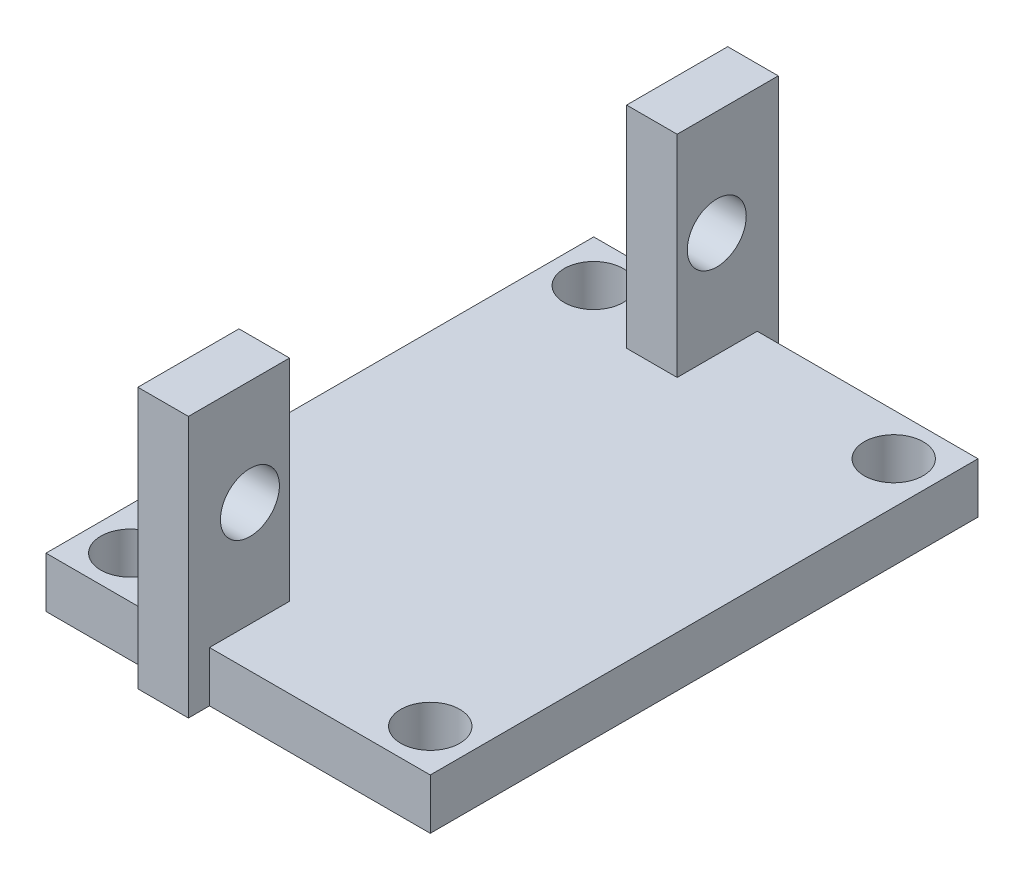
ISO-10303-21;
HEADER;
FILE_DESCRIPTION(('STEP AP214'),'2;1');
FILE_NAME('part.step','',(''),(''),'','','');
FILE_SCHEMA(('AUTOMOTIVE_DESIGN { 1 0 10303 214 1 1 1 1 }'));
ENDSEC;
DATA;
#1=APPLICATION_CONTEXT('core data for automotive mechanical design processes');
#2=APPLICATION_PROTOCOL_DEFINITION('international standard','automotive_design',2000,#1);
#3=PRODUCT_CONTEXT('',#1,'mechanical');
#4=PRODUCT('Part','Part','',(#3));
#5=PRODUCT_RELATED_PRODUCT_CATEGORY('part','',(#4));
#6=PRODUCT_DEFINITION_FORMATION('','',#4);
#7=PRODUCT_DEFINITION_CONTEXT('part definition',#1,'design');
#8=PRODUCT_DEFINITION('design','',#6,#7);
#9=PRODUCT_DEFINITION_SHAPE('','',#8);
#10=(LENGTH_UNIT() NAMED_UNIT(*) SI_UNIT(.MILLI.,.METRE.));
#11=(NAMED_UNIT(*) PLANE_ANGLE_UNIT() SI_UNIT($,.RADIAN.));
#12=(NAMED_UNIT(*) SI_UNIT($,.STERADIAN.) SOLID_ANGLE_UNIT());
#13=UNCERTAINTY_MEASURE_WITH_UNIT(LENGTH_MEASURE(1.E-05),#10,'distance_accuracy_value','');
#14=(GEOMETRIC_REPRESENTATION_CONTEXT(3) GLOBAL_UNCERTAINTY_ASSIGNED_CONTEXT((#13)) GLOBAL_UNIT_ASSIGNED_CONTEXT((#10,
#11,#12)) REPRESENTATION_CONTEXT('',''));
#15=CARTESIAN_POINT('',(0.,0.,0.));
#16=DIRECTION('',(0.,0.,1.));
#17=DIRECTION('',(1.,0.,0.));
#18=AXIS2_PLACEMENT_3D('',#15,#16,#17);
#19=CARTESIAN_POINT('',(0.,3.,0.));
#20=DIRECTION('',(0.,1.,0.));
#21=DIRECTION('',(0.,0.,1.));
#22=AXIS2_PLACEMENT_3D('',#19,#20,#21);
#23=PLANE('',#22);
#24=CARTESIAN_POINT('',(8.90000000000001,3.,-13.75));
#25=DIRECTION('',(0.,1.,0.));
#26=DIRECTION('',(0.,0.,1.));
#27=AXIS2_PLACEMENT_3D('',#24,#25,#26);
#28=CIRCLE('',#27,1.75);
#29=CARTESIAN_POINT('',(8.90000000000001,3.,-12.));
#30=VERTEX_POINT('',#29);
#31=EDGE_CURVE('E232',#30,#30,#28,.T.);
#32=ORIENTED_EDGE('',*,*,#31,.F.);
#33=EDGE_LOOP('',(#32));
#34=FACE_BOUND('',#33,.T.);
#35=CARTESIAN_POINT('',(-8.9,3.,13.75));
#36=DIRECTION('',(0.,1.,0.));
#37=DIRECTION('',(0.,0.,1.));
#38=AXIS2_PLACEMENT_3D('',#35,#36,#37);
#39=CIRCLE('',#38,1.75);
#40=CARTESIAN_POINT('',(-8.9,3.,15.5));
#41=VERTEX_POINT('',#40);
#42=EDGE_CURVE('E231',#41,#41,#39,.T.);
#43=ORIENTED_EDGE('',*,*,#42,.F.);
#44=EDGE_LOOP('',(#43));
#45=FACE_BOUND('',#44,.T.);
#46=CARTESIAN_POINT('',(8.90000000000001,3.,13.75));
#47=DIRECTION('',(0.,1.,0.));
#48=DIRECTION('',(0.,0.,1.));
#49=AXIS2_PLACEMENT_3D('',#46,#47,#48);
#50=CIRCLE('',#49,1.75);
#51=CARTESIAN_POINT('',(8.90000000000001,3.,15.5));
#52=VERTEX_POINT('',#51);
#53=EDGE_CURVE('E228',#52,#52,#50,.T.);
#54=ORIENTED_EDGE('',*,*,#53,.F.);
#55=EDGE_LOOP('',(#54));
#56=FACE_BOUND('',#55,.T.);
#57=CARTESIAN_POINT('',(-8.9,3.,-13.75));
#58=DIRECTION('',(0.,1.,0.));
#59=DIRECTION('',(0.,0.,1.));
#60=AXIS2_PLACEMENT_3D('',#57,#58,#59);
#61=CIRCLE('',#60,1.75);
#62=CARTESIAN_POINT('',(-8.9,3.,-12.));
#63=VERTEX_POINT('',#62);
#64=EDGE_CURVE('E235',#63,#63,#61,.T.);
#65=ORIENTED_EDGE('',*,*,#64,.F.);
#66=EDGE_LOOP('',(#65));
#67=FACE_BOUND('',#66,.T.);
#68=DIRECTION('',(-1.,0.,0.));
#69=VECTOR('',#68,1.);
#70=CARTESIAN_POINT('',(-11.4,3.,-16.25));
#71=LINE('',#70,#69);
#72=CARTESIAN_POINT('',(11.4,3.,-16.25));
#73=VERTEX_POINT('',#72);
#74=CARTESIAN_POINT('',(-1.7,3.,-16.25));
#75=VERTEX_POINT('',#74);
#76=EDGE_CURVE('E246',#73,#75,#71,.T.);
#77=ORIENTED_EDGE('',*,*,#76,.T.);
#78=DIRECTION('',(0.,0.,1.));
#79=VECTOR('',#78,1.);
#80=CARTESIAN_POINT('',(-1.7,3.,0.));
#81=LINE('',#80,#79);
#82=CARTESIAN_POINT('',(-1.7,3.,-11.5));
#83=VERTEX_POINT('',#82);
#84=EDGE_CURVE('E57',#75,#83,#81,.T.);
#85=ORIENTED_EDGE('',*,*,#84,.T.);
#86=DIRECTION('',(-1.,0.,0.));
#87=VECTOR('',#86,1.);
#88=CARTESIAN_POINT('',(0.,3.,-11.5));
#89=LINE('',#88,#87);
#90=CARTESIAN_POINT('',(-4.7,3.,-11.5));
#91=VERTEX_POINT('',#90);
#92=EDGE_CURVE('E52',#83,#91,#89,.T.);
#93=ORIENTED_EDGE('',*,*,#92,.T.);
#94=DIRECTION('',(0.,0.,-1.));
#95=VECTOR('',#94,1.);
#96=CARTESIAN_POINT('',(-4.7,3.,0.));
#97=LINE('',#96,#95);
#98=CARTESIAN_POINT('',(-4.7,3.,-16.25));
#99=VERTEX_POINT('',#98);
#100=EDGE_CURVE('E184',#91,#99,#97,.T.);
#101=ORIENTED_EDGE('',*,*,#100,.T.);
#102=CARTESIAN_POINT('',(-11.4,3.,-16.25));
#103=VERTEX_POINT('',#102);
#104=EDGE_CURVE('E244',#99,#103,#71,.T.);
#105=ORIENTED_EDGE('',*,*,#104,.T.);
#106=DIRECTION('',(0.,0.,1.));
#107=VECTOR('',#106,1.);
#108=CARTESIAN_POINT('',(-11.4,3.,-16.25));
#109=LINE('',#108,#107);
#110=CARTESIAN_POINT('',(-11.4,3.,16.25));
#111=VERTEX_POINT('',#110);
#112=EDGE_CURVE('E248',#103,#111,#109,.T.);
#113=ORIENTED_EDGE('',*,*,#112,.T.);
#114=DIRECTION('',(1.,0.,0.));
#115=VECTOR('',#114,1.);
#116=CARTESIAN_POINT('',(-11.4,3.,16.25));
#117=LINE('',#116,#115);
#118=CARTESIAN_POINT('',(-4.7,3.,16.25));
#119=VERTEX_POINT('',#118);
#120=EDGE_CURVE('E251',#111,#119,#117,.T.);
#121=ORIENTED_EDGE('',*,*,#120,.T.);
#122=DIRECTION('',(0.,0.,-1.));
#123=VECTOR('',#122,1.);
#124=CARTESIAN_POINT('',(-4.7,3.,0.));
#125=LINE('',#124,#123);
#126=CARTESIAN_POINT('',(-4.7,3.,11.5));
#127=VERTEX_POINT('',#126);
#128=EDGE_CURVE('E223',#119,#127,#125,.T.);
#129=ORIENTED_EDGE('',*,*,#128,.T.);
#130=DIRECTION('',(1.,0.,0.));
#131=VECTOR('',#130,1.);
#132=CARTESIAN_POINT('',(0.,3.,11.5));
#133=LINE('',#132,#131);
#134=CARTESIAN_POINT('',(-1.7,3.,11.5));
#135=VERTEX_POINT('',#134);
#136=EDGE_CURVE('E215',#127,#135,#133,.T.);
#137=ORIENTED_EDGE('',*,*,#136,.T.);
#138=DIRECTION('',(0.,0.,1.));
#139=VECTOR('',#138,1.);
#140=CARTESIAN_POINT('',(-1.7,3.,0.));
#141=LINE('',#140,#139);
#142=CARTESIAN_POINT('',(-1.7,3.,16.25));
#143=VERTEX_POINT('',#142);
#144=EDGE_CURVE('E218',#135,#143,#141,.T.);
#145=ORIENTED_EDGE('',*,*,#144,.T.);
#146=CARTESIAN_POINT('',(11.4,3.,16.25));
#147=VERTEX_POINT('',#146);
#148=EDGE_CURVE('E250',#143,#147,#117,.T.);
#149=ORIENTED_EDGE('',*,*,#148,.T.);
#150=DIRECTION('',(0.,0.,-1.));
#151=VECTOR('',#150,1.);
#152=CARTESIAN_POINT('',(11.4,3.,-16.25));
#153=LINE('',#152,#151);
#154=EDGE_CURVE('E241',#147,#73,#153,.T.);
#155=ORIENTED_EDGE('',*,*,#154,.T.);
#156=EDGE_LOOP('',(#77,#85,#93,#101,#105,#113,#121,#129,#137,#145,#149,#155));
#157=FACE_BOUND('',#156,.T.);
#158=ADVANCED_FACE('F35',(#34,#45,#56,#67,#157),#23,.T.);
#159=CARTESIAN_POINT('',(-11.4,3.,-16.25));
#160=DIRECTION('',(0.,0.,1.));
#161=DIRECTION('',(1.,0.,0.));
#162=AXIS2_PLACEMENT_3D('',#159,#160,#161);
#163=PLANE('',#162);
#164=DIRECTION('',(0.,-1.,0.));
#165=VECTOR('',#164,1.);
#166=CARTESIAN_POINT('',(-1.7,3.,-16.25));
#167=LINE('',#166,#165);
#168=CARTESIAN_POINT('',(-1.7,0.,-16.25));
#169=VERTEX_POINT('',#168);
#170=EDGE_CURVE('E186',#75,#169,#167,.T.);
#171=ORIENTED_EDGE('',*,*,#170,.F.);
#172=ORIENTED_EDGE('',*,*,#76,.F.);
#173=DIRECTION('',(0.,-1.,0.));
#174=VECTOR('',#173,1.);
#175=CARTESIAN_POINT('',(11.4,3.,-16.25));
#176=LINE('',#175,#174);
#177=CARTESIAN_POINT('',(11.4,0.,-16.25));
#178=VERTEX_POINT('',#177);
#179=EDGE_CURVE('E11',#73,#178,#176,.T.);
#180=ORIENTED_EDGE('',*,*,#179,.T.);
#181=DIRECTION('',(-1.,0.,0.));
#182=VECTOR('',#181,1.);
#183=CARTESIAN_POINT('',(-11.4,0.,-16.25));
#184=LINE('',#183,#182);
#185=EDGE_CURVE('E260',#178,#169,#184,.T.);
#186=ORIENTED_EDGE('',*,*,#185,.T.);
#187=EDGE_LOOP('',(#171,#172,#180,#186));
#188=FACE_BOUND('',#187,.T.);
#189=ADVANCED_FACE('F305',(#188),#163,.F.);
#190=DIRECTION('',(0.,1.,0.));
#191=VECTOR('',#190,1.);
#192=CARTESIAN_POINT('',(-4.7,3.,-16.25));
#193=LINE('',#192,#191);
#194=CARTESIAN_POINT('',(-4.7,0.,-16.25));
#195=VERTEX_POINT('',#194);
#196=EDGE_CURVE('E176',#195,#99,#193,.T.);
#197=ORIENTED_EDGE('',*,*,#196,.F.);
#198=CARTESIAN_POINT('',(-11.4,0.,-16.25));
#199=VERTEX_POINT('',#198);
#200=EDGE_CURVE('E258',#195,#199,#184,.T.);
#201=ORIENTED_EDGE('',*,*,#200,.T.);
#202=DIRECTION('',(0.,-1.,0.));
#203=VECTOR('',#202,1.);
#204=CARTESIAN_POINT('',(-11.4,3.,-16.25));
#205=LINE('',#204,#203);
#206=EDGE_CURVE('E44',#103,#199,#205,.T.);
#207=ORIENTED_EDGE('',*,*,#206,.F.);
#208=ORIENTED_EDGE('',*,*,#104,.F.);
#209=EDGE_LOOP('',(#197,#201,#207,#208));
#210=FACE_BOUND('',#209,.T.);
#211=ADVANCED_FACE('F311',(#210),#163,.F.);
#212=CARTESIAN_POINT('',(-11.4,3.,16.25));
#213=DIRECTION('',(0.,0.,-1.));
#214=DIRECTION('',(-1.,0.,0.));
#215=AXIS2_PLACEMENT_3D('',#212,#213,#214);
#216=PLANE('',#215);
#217=DIRECTION('',(0.,-1.,0.));
#218=VECTOR('',#217,1.);
#219=CARTESIAN_POINT('',(-4.7,3.,16.25));
#220=LINE('',#219,#218);
#221=CARTESIAN_POINT('',(-4.7,0.,16.25));
#222=VERTEX_POINT('',#221);
#223=EDGE_CURVE('E226',#119,#222,#220,.T.);
#224=ORIENTED_EDGE('',*,*,#223,.F.);
#225=ORIENTED_EDGE('',*,*,#120,.F.);
#226=DIRECTION('',(0.,-1.,0.));
#227=VECTOR('',#226,1.);
#228=CARTESIAN_POINT('',(-11.4,3.,16.25));
#229=LINE('',#228,#227);
#230=CARTESIAN_POINT('',(-11.4,0.,16.25));
#231=VERTEX_POINT('',#230);
#232=EDGE_CURVE('E269',#111,#231,#229,.T.);
#233=ORIENTED_EDGE('',*,*,#232,.T.);
#234=DIRECTION('',(1.,0.,0.));
#235=VECTOR('',#234,1.);
#236=CARTESIAN_POINT('',(-11.4,0.,16.25));
#237=LINE('',#236,#235);
#238=EDGE_CURVE('E245',#231,#222,#237,.T.);
#239=ORIENTED_EDGE('',*,*,#238,.T.);
#240=EDGE_LOOP('',(#224,#225,#233,#239));
#241=FACE_BOUND('',#240,.T.);
#242=ADVANCED_FACE('F322',(#241),#216,.F.);
#243=DIRECTION('',(0.,1.,0.));
#244=VECTOR('',#243,1.);
#245=CARTESIAN_POINT('',(-1.7,3.,16.25));
#246=LINE('',#245,#244);
#247=CARTESIAN_POINT('',(-1.7,0.,16.25));
#248=VERTEX_POINT('',#247);
#249=EDGE_CURVE('E221',#248,#143,#246,.T.);
#250=ORIENTED_EDGE('',*,*,#249,.F.);
#251=CARTESIAN_POINT('',(11.4,0.,16.25));
#252=VERTEX_POINT('',#251);
#253=EDGE_CURVE('E264',#248,#252,#237,.T.);
#254=ORIENTED_EDGE('',*,*,#253,.T.);
#255=DIRECTION('',(0.,-1.,0.));
#256=VECTOR('',#255,1.);
#257=CARTESIAN_POINT('',(11.4,3.,16.25));
#258=LINE('',#257,#256);
#259=EDGE_CURVE('E254',#147,#252,#258,.T.);
#260=ORIENTED_EDGE('',*,*,#259,.F.);
#261=ORIENTED_EDGE('',*,*,#148,.F.);
#262=EDGE_LOOP('',(#250,#254,#260,#261));
#263=FACE_BOUND('',#262,.T.);
#264=ADVANCED_FACE('F325',(#263),#216,.F.);
#265=CARTESIAN_POINT('',(11.4,3.,-16.25));
#266=DIRECTION('',(-1.,0.,0.));
#267=DIRECTION('',(0.,0.,1.));
#268=AXIS2_PLACEMENT_3D('',#265,#266,#267);
#269=PLANE('',#268);
#270=DIRECTION('',(0.,0.,-1.));
#271=VECTOR('',#270,1.);
#272=CARTESIAN_POINT('',(11.4,0.,-16.25));
#273=LINE('',#272,#271);
#274=EDGE_CURVE('E255',#252,#178,#273,.T.);
#275=ORIENTED_EDGE('',*,*,#274,.T.);
#276=ORIENTED_EDGE('',*,*,#179,.F.);
#277=ORIENTED_EDGE('',*,*,#154,.F.);
#278=ORIENTED_EDGE('',*,*,#259,.T.);
#279=EDGE_LOOP('',(#275,#276,#277,#278));
#280=FACE_BOUND('',#279,.T.);
#281=ADVANCED_FACE('F37',(#280),#269,.F.);
#282=CARTESIAN_POINT('',(-11.4,3.,-16.25));
#283=DIRECTION('',(1.,0.,0.));
#284=DIRECTION('',(0.,0.,-1.));
#285=AXIS2_PLACEMENT_3D('',#282,#283,#284);
#286=PLANE('',#285);
#287=DIRECTION('',(0.,0.,1.));
#288=VECTOR('',#287,1.);
#289=CARTESIAN_POINT('',(-11.4,0.,-16.25));
#290=LINE('',#289,#288);
#291=EDGE_CURVE('E262',#199,#231,#290,.T.);
#292=ORIENTED_EDGE('',*,*,#291,.T.);
#293=ORIENTED_EDGE('',*,*,#232,.F.);
#294=ORIENTED_EDGE('',*,*,#112,.F.);
#295=ORIENTED_EDGE('',*,*,#206,.T.);
#296=EDGE_LOOP('',(#292,#293,#294,#295));
#297=FACE_BOUND('',#296,.T.);
#298=ADVANCED_FACE('F320',(#297),#286,.F.);
#299=CARTESIAN_POINT('',(0.,0.,0.));
#300=DIRECTION('',(0.,1.,0.));
#301=DIRECTION('',(0.,0.,1.));
#302=AXIS2_PLACEMENT_3D('',#299,#300,#301);
#303=PLANE('',#302);
#304=ORIENTED_EDGE('',*,*,#200,.F.);
#305=DIRECTION('',(0.,0.,1.));
#306=VECTOR('',#305,1.);
#307=CARTESIAN_POINT('',(-4.7,0.,0.));
#308=LINE('',#307,#306);
#309=CARTESIAN_POINT('',(-4.7,0.,-17.5));
#310=VERTEX_POINT('',#309);
#311=EDGE_CURVE('E168',#310,#195,#308,.T.);
#312=ORIENTED_EDGE('',*,*,#311,.F.);
#313=DIRECTION('',(-1.,0.,0.));
#314=VECTOR('',#313,1.);
#315=CARTESIAN_POINT('',(0.,0.,-17.5));
#316=LINE('',#315,#314);
#317=CARTESIAN_POINT('',(-1.7,0.,-17.5));
#318=VERTEX_POINT('',#317);
#319=EDGE_CURVE('E351',#318,#310,#316,.T.);
#320=ORIENTED_EDGE('',*,*,#319,.F.);
#321=DIRECTION('',(0.,0.,-1.));
#322=VECTOR('',#321,1.);
#323=CARTESIAN_POINT('',(-1.7,0.,0.));
#324=LINE('',#323,#322);
#325=EDGE_CURVE('E173',#169,#318,#324,.T.);
#326=ORIENTED_EDGE('',*,*,#325,.F.);
#327=ORIENTED_EDGE('',*,*,#185,.F.);
#328=ORIENTED_EDGE('',*,*,#274,.F.);
#329=ORIENTED_EDGE('',*,*,#253,.F.);
#330=DIRECTION('',(0.,0.,-1.));
#331=VECTOR('',#330,1.);
#332=CARTESIAN_POINT('',(-1.7,0.,0.));
#333=LINE('',#332,#331);
#334=CARTESIAN_POINT('',(-1.7,0.,17.5));
#335=VERTEX_POINT('',#334);
#336=EDGE_CURVE('E194',#335,#248,#333,.T.);
#337=ORIENTED_EDGE('',*,*,#336,.F.);
#338=DIRECTION('',(1.,0.,0.));
#339=VECTOR('',#338,1.);
#340=CARTESIAN_POINT('',(0.,0.,17.5));
#341=LINE('',#340,#339);
#342=CARTESIAN_POINT('',(-4.7,0.,17.5));
#343=VERTEX_POINT('',#342);
#344=EDGE_CURVE('E202',#343,#335,#341,.T.);
#345=ORIENTED_EDGE('',*,*,#344,.F.);
#346=DIRECTION('',(0.,0.,1.));
#347=VECTOR('',#346,1.);
#348=CARTESIAN_POINT('',(-4.7,0.,0.));
#349=LINE('',#348,#347);
#350=EDGE_CURVE('E189',#222,#343,#349,.T.);
#351=ORIENTED_EDGE('',*,*,#350,.F.);
#352=ORIENTED_EDGE('',*,*,#238,.F.);
#353=ORIENTED_EDGE('',*,*,#291,.F.);
#354=EDGE_LOOP('',(#304,#312,#320,#326,#327,#328,#329,#337,#345,#351,#352,#353));
#355=FACE_BOUND('',#354,.T.);
#356=CARTESIAN_POINT('',(8.90000000000001,0.,-13.75));
#357=DIRECTION('',(0.,1.,0.));
#358=DIRECTION('',(0.,0.,1.));
#359=AXIS2_PLACEMENT_3D('',#356,#357,#358);
#360=CIRCLE('',#359,1.75);
#361=CARTESIAN_POINT('',(8.90000000000001,0.,-12.));
#362=VERTEX_POINT('',#361);
#363=EDGE_CURVE('E259',#362,#362,#360,.T.);
#364=ORIENTED_EDGE('',*,*,#363,.T.);
#365=EDGE_LOOP('',(#364));
#366=FACE_BOUND('',#365,.T.);
#367=CARTESIAN_POINT('',(-8.9,0.,13.75));
#368=DIRECTION('',(0.,1.,0.));
#369=DIRECTION('',(0.,0.,1.));
#370=AXIS2_PLACEMENT_3D('',#367,#368,#369);
#371=CIRCLE('',#370,1.75);
#372=CARTESIAN_POINT('',(-8.9,0.,15.5));
#373=VERTEX_POINT('',#372);
#374=EDGE_CURVE('E279',#373,#373,#371,.T.);
#375=ORIENTED_EDGE('',*,*,#374,.T.);
#376=EDGE_LOOP('',(#375));
#377=FACE_BOUND('',#376,.T.);
#378=CARTESIAN_POINT('',(8.90000000000001,0.,13.75));
#379=DIRECTION('',(0.,1.,0.));
#380=DIRECTION('',(0.,0.,1.));
#381=AXIS2_PLACEMENT_3D('',#378,#379,#380);
#382=CIRCLE('',#381,1.75);
#383=CARTESIAN_POINT('',(8.90000000000001,0.,15.5));
#384=VERTEX_POINT('',#383);
#385=EDGE_CURVE('E276',#384,#384,#382,.T.);
#386=ORIENTED_EDGE('',*,*,#385,.T.);
#387=EDGE_LOOP('',(#386));
#388=FACE_BOUND('',#387,.T.);
#389=CARTESIAN_POINT('',(-8.9,0.,-13.75));
#390=DIRECTION('',(0.,1.,0.));
#391=DIRECTION('',(0.,0.,1.));
#392=AXIS2_PLACEMENT_3D('',#389,#390,#391);
#393=CIRCLE('',#392,1.75);
#394=CARTESIAN_POINT('',(-8.9,0.,-12.));
#395=VERTEX_POINT('',#394);
#396=EDGE_CURVE('E240',#395,#395,#393,.T.);
#397=ORIENTED_EDGE('',*,*,#396,.T.);
#398=EDGE_LOOP('',(#397));
#399=FACE_BOUND('',#398,.T.);
#400=ADVANCED_FACE('F284',(#355,#366,#377,#388,#399),#303,.F.);
#401=CARTESIAN_POINT('',(-8.9,-7.,-13.75));
#402=DIRECTION('',(0.,1.,0.));
#403=DIRECTION('',(0.,0.,1.));
#404=AXIS2_PLACEMENT_3D('',#401,#402,#403);
#405=CYLINDRICAL_SURFACE('',#404,1.75);
#406=ORIENTED_EDGE('',*,*,#64,.T.);
#407=EDGE_LOOP('',(#406));
#408=FACE_BOUND('',#407,.T.);
#409=ORIENTED_EDGE('',*,*,#396,.F.);
#410=EDGE_LOOP('',(#409));
#411=FACE_BOUND('',#410,.T.);
#412=ADVANCED_FACE('F317',(#408,#411),#405,.F.);
#413=CARTESIAN_POINT('',(8.90000000000001,-7.,13.75));
#414=DIRECTION('',(0.,1.,0.));
#415=DIRECTION('',(0.,0.,1.));
#416=AXIS2_PLACEMENT_3D('',#413,#414,#415);
#417=CYLINDRICAL_SURFACE('',#416,1.75);
#418=ORIENTED_EDGE('',*,*,#53,.T.);
#419=EDGE_LOOP('',(#418));
#420=FACE_BOUND('',#419,.T.);
#421=ORIENTED_EDGE('',*,*,#385,.F.);
#422=EDGE_LOOP('',(#421));
#423=FACE_BOUND('',#422,.T.);
#424=ADVANCED_FACE('F300',(#420,#423),#417,.F.);
#425=CARTESIAN_POINT('',(-8.9,-7.,13.75));
#426=DIRECTION('',(0.,1.,0.));
#427=DIRECTION('',(0.,0.,1.));
#428=AXIS2_PLACEMENT_3D('',#425,#426,#427);
#429=CYLINDRICAL_SURFACE('',#428,1.75);
#430=ORIENTED_EDGE('',*,*,#42,.T.);
#431=EDGE_LOOP('',(#430));
#432=FACE_BOUND('',#431,.T.);
#433=ORIENTED_EDGE('',*,*,#374,.F.);
#434=EDGE_LOOP('',(#433));
#435=FACE_BOUND('',#434,.T.);
#436=ADVANCED_FACE('F290',(#432,#435),#429,.F.);
#437=CARTESIAN_POINT('',(8.90000000000001,-7.,-13.75));
#438=DIRECTION('',(0.,1.,0.));
#439=DIRECTION('',(0.,0.,1.));
#440=AXIS2_PLACEMENT_3D('',#437,#438,#439);
#441=CYLINDRICAL_SURFACE('',#440,1.75);
#442=ORIENTED_EDGE('',*,*,#31,.T.);
#443=EDGE_LOOP('',(#442));
#444=FACE_BOUND('',#443,.T.);
#445=ORIENTED_EDGE('',*,*,#363,.F.);
#446=EDGE_LOOP('',(#445));
#447=FACE_BOUND('',#446,.T.);
#448=ADVANCED_FACE('F287',(#444,#447),#441,.F.);
#449=CARTESIAN_POINT('',(-4.7,15.5,0.));
#450=DIRECTION('',(1.,0.,0.));
#451=DIRECTION('',(0.,0.,-1.));
#452=AXIS2_PLACEMENT_3D('',#449,#450,#451);
#453=PLANE('',#452);
#454=CARTESIAN_POINT('',(-4.7,9.25,13.85));
#455=DIRECTION('',(1.,0.,0.));
#456=DIRECTION('',(0.,0.,-1.));
#457=AXIS2_PLACEMENT_3D('',#454,#455,#456);
#458=CIRCLE('',#457,1.75);
#459=CARTESIAN_POINT('',(-4.7,9.25,12.1));
#460=VERTEX_POINT('',#459);
#461=EDGE_CURVE('E365',#460,#460,#458,.T.);
#462=ORIENTED_EDGE('',*,*,#461,.T.);
#463=EDGE_LOOP('',(#462));
#464=FACE_BOUND('',#463,.T.);
#465=ORIENTED_EDGE('',*,*,#128,.F.);
#466=ORIENTED_EDGE('',*,*,#223,.T.);
#467=ORIENTED_EDGE('',*,*,#350,.T.);
#468=DIRECTION('',(0.,-1.,0.));
#469=VECTOR('',#468,1.);
#470=CARTESIAN_POINT('',(-4.7,15.5,17.5));
#471=LINE('',#470,#469);
#472=CARTESIAN_POINT('',(-4.7,15.5,17.5));
#473=VERTEX_POINT('',#472);
#474=EDGE_CURVE('E212',#473,#343,#471,.T.);
#475=ORIENTED_EDGE('',*,*,#474,.F.);
#476=DIRECTION('',(0.,0.,1.));
#477=VECTOR('',#476,1.);
#478=CARTESIAN_POINT('',(-4.7,15.5,0.));
#479=LINE('',#478,#477);
#480=CARTESIAN_POINT('',(-4.7,15.5,11.5));
#481=VERTEX_POINT('',#480);
#482=EDGE_CURVE('E190',#481,#473,#479,.T.);
#483=ORIENTED_EDGE('',*,*,#482,.F.);
#484=DIRECTION('',(0.,-1.,0.));
#485=VECTOR('',#484,1.);
#486=CARTESIAN_POINT('',(-4.7,15.5,11.5));
#487=LINE('',#486,#485);
#488=EDGE_CURVE('E200',#481,#127,#487,.T.);
#489=ORIENTED_EDGE('',*,*,#488,.T.);
#490=EDGE_LOOP('',(#465,#466,#467,#475,#483,#489));
#491=FACE_BOUND('',#490,.T.);
#492=ADVANCED_FACE('F289',(#464,#491),#453,.F.);
#493=CARTESIAN_POINT('',(-1.7,15.5,0.));
#494=DIRECTION('',(-1.,0.,0.));
#495=DIRECTION('',(0.,0.,1.));
#496=AXIS2_PLACEMENT_3D('',#493,#494,#495);
#497=PLANE('',#496);
#498=CARTESIAN_POINT('',(-1.7,9.25,13.85));
#499=DIRECTION('',(1.,0.,0.));
#500=DIRECTION('',(0.,0.,-1.));
#501=AXIS2_PLACEMENT_3D('',#498,#499,#500);
#502=CIRCLE('',#501,1.75);
#503=CARTESIAN_POINT('',(-1.7,9.25,12.1));
#504=VERTEX_POINT('',#503);
#505=EDGE_CURVE('E370',#504,#504,#502,.T.);
#506=ORIENTED_EDGE('',*,*,#505,.F.);
#507=EDGE_LOOP('',(#506));
#508=FACE_BOUND('',#507,.T.);
#509=ORIENTED_EDGE('',*,*,#336,.T.);
#510=ORIENTED_EDGE('',*,*,#249,.T.);
#511=ORIENTED_EDGE('',*,*,#144,.F.);
#512=DIRECTION('',(0.,-1.,0.));
#513=VECTOR('',#512,1.);
#514=CARTESIAN_POINT('',(-1.7,15.5,11.5));
#515=LINE('',#514,#513);
#516=CARTESIAN_POINT('',(-1.7,15.5,11.5));
#517=VERTEX_POINT('',#516);
#518=EDGE_CURVE('E207',#517,#135,#515,.T.);
#519=ORIENTED_EDGE('',*,*,#518,.F.);
#520=DIRECTION('',(0.,0.,-1.));
#521=VECTOR('',#520,1.);
#522=CARTESIAN_POINT('',(-1.7,15.5,0.));
#523=LINE('',#522,#521);
#524=CARTESIAN_POINT('',(-1.7,15.5,17.5));
#525=VERTEX_POINT('',#524);
#526=EDGE_CURVE('E196',#525,#517,#523,.T.);
#527=ORIENTED_EDGE('',*,*,#526,.F.);
#528=DIRECTION('',(0.,-1.,0.));
#529=VECTOR('',#528,1.);
#530=CARTESIAN_POINT('',(-1.7,15.5,17.5));
#531=LINE('',#530,#529);
#532=EDGE_CURVE('E209',#525,#335,#531,.T.);
#533=ORIENTED_EDGE('',*,*,#532,.T.);
#534=EDGE_LOOP('',(#509,#510,#511,#519,#527,#533));
#535=FACE_BOUND('',#534,.T.);
#536=ADVANCED_FACE('F297',(#508,#535),#497,.F.);
#537=CARTESIAN_POINT('',(0.,15.5,17.5));
#538=DIRECTION('',(0.,0.,-1.));
#539=DIRECTION('',(-1.,0.,0.));
#540=AXIS2_PLACEMENT_3D('',#537,#538,#539);
#541=PLANE('',#540);
#542=ORIENTED_EDGE('',*,*,#344,.T.);
#543=ORIENTED_EDGE('',*,*,#532,.F.);
#544=DIRECTION('',(1.,0.,0.));
#545=VECTOR('',#544,1.);
#546=CARTESIAN_POINT('',(0.,15.5,17.5));
#547=LINE('',#546,#545);
#548=EDGE_CURVE('E193',#473,#525,#547,.T.);
#549=ORIENTED_EDGE('',*,*,#548,.F.);
#550=ORIENTED_EDGE('',*,*,#474,.T.);
#551=EDGE_LOOP('',(#542,#543,#549,#550));
#552=FACE_BOUND('',#551,.T.);
#553=ADVANCED_FACE('F383',(#552),#541,.F.);
#554=CARTESIAN_POINT('',(0.,15.5,11.5));
#555=DIRECTION('',(0.,0.,1.));
#556=DIRECTION('',(1.,0.,0.));
#557=AXIS2_PLACEMENT_3D('',#554,#555,#556);
#558=PLANE('',#557);
#559=ORIENTED_EDGE('',*,*,#136,.F.);
#560=ORIENTED_EDGE('',*,*,#488,.F.);
#561=DIRECTION('',(-1.,0.,0.));
#562=VECTOR('',#561,1.);
#563=CARTESIAN_POINT('',(0.,15.5,11.5));
#564=LINE('',#563,#562);
#565=EDGE_CURVE('E198',#517,#481,#564,.T.);
#566=ORIENTED_EDGE('',*,*,#565,.F.);
#567=ORIENTED_EDGE('',*,*,#518,.T.);
#568=EDGE_LOOP('',(#559,#560,#566,#567));
#569=FACE_BOUND('',#568,.T.);
#570=ADVANCED_FACE('F400',(#569),#558,.F.);
#571=CARTESIAN_POINT('',(0.,15.5,0.));
#572=DIRECTION('',(0.,1.,0.));
#573=DIRECTION('',(0.,0.,1.));
#574=AXIS2_PLACEMENT_3D('',#571,#572,#573);
#575=PLANE('',#574);
#576=ORIENTED_EDGE('',*,*,#482,.T.);
#577=ORIENTED_EDGE('',*,*,#548,.T.);
#578=ORIENTED_EDGE('',*,*,#526,.T.);
#579=ORIENTED_EDGE('',*,*,#565,.T.);
#580=EDGE_LOOP('',(#576,#577,#578,#579));
#581=FACE_BOUND('',#580,.T.);
#582=ADVANCED_FACE('F402',(#581),#575,.T.);
#583=CARTESIAN_POINT('',(-1.7,15.5,0.));
#584=DIRECTION('',(-1.,0.,0.));
#585=DIRECTION('',(0.,0.,1.));
#586=AXIS2_PLACEMENT_3D('',#583,#584,#585);
#587=PLANE('',#586);
#588=CARTESIAN_POINT('',(-1.7,9.25000000000001,-13.85));
#589=DIRECTION('',(1.,0.,0.));
#590=DIRECTION('',(0.,0.,-1.));
#591=AXIS2_PLACEMENT_3D('',#588,#589,#590);
#592=CIRCLE('',#591,1.75);
#593=CARTESIAN_POINT('',(-1.7,9.25000000000001,-15.6));
#594=VERTEX_POINT('',#593);
#595=EDGE_CURVE('E372',#594,#594,#592,.T.);
#596=ORIENTED_EDGE('',*,*,#595,.F.);
#597=EDGE_LOOP('',(#596));
#598=FACE_BOUND('',#597,.T.);
#599=ORIENTED_EDGE('',*,*,#84,.F.);
#600=ORIENTED_EDGE('',*,*,#170,.T.);
#601=ORIENTED_EDGE('',*,*,#325,.T.);
#602=DIRECTION('',(0.,-1.,0.));
#603=VECTOR('',#602,1.);
#604=CARTESIAN_POINT('',(-1.7,15.5,-17.5));
#605=LINE('',#604,#603);
#606=CARTESIAN_POINT('',(-1.7,15.5,-17.5));
#607=VERTEX_POINT('',#606);
#608=EDGE_CURVE('E153',#607,#318,#605,.T.);
#609=ORIENTED_EDGE('',*,*,#608,.F.);
#610=DIRECTION('',(0.,0.,-1.));
#611=VECTOR('',#610,1.);
#612=CARTESIAN_POINT('',(-1.7,15.5,0.));
#613=LINE('',#612,#611);
#614=CARTESIAN_POINT('',(-1.7,15.5,-11.5));
#615=VERTEX_POINT('',#614);
#616=EDGE_CURVE('E159',#615,#607,#613,.T.);
#617=ORIENTED_EDGE('',*,*,#616,.F.);
#618=DIRECTION('',(0.,-1.,0.));
#619=VECTOR('',#618,1.);
#620=CARTESIAN_POINT('',(-1.7,15.5,-11.5));
#621=LINE('',#620,#619);
#622=EDGE_CURVE('E357',#615,#83,#621,.T.);
#623=ORIENTED_EDGE('',*,*,#622,.T.);
#624=EDGE_LOOP('',(#599,#600,#601,#609,#617,#623));
#625=FACE_BOUND('',#624,.T.);
#626=ADVANCED_FACE('F170',(#598,#625),#587,.F.);
#627=CARTESIAN_POINT('',(0.,15.5,-17.5));
#628=DIRECTION('',(0.,0.,1.));
#629=DIRECTION('',(1.,0.,0.));
#630=AXIS2_PLACEMENT_3D('',#627,#628,#629);
#631=PLANE('',#630);
#632=ORIENTED_EDGE('',*,*,#319,.T.);
#633=DIRECTION('',(0.,-1.,0.));
#634=VECTOR('',#633,1.);
#635=CARTESIAN_POINT('',(-4.7,15.5,-17.5));
#636=LINE('',#635,#634);
#637=CARTESIAN_POINT('',(-4.7,15.5,-17.5));
#638=VERTEX_POINT('',#637);
#639=EDGE_CURVE('E155',#638,#310,#636,.T.);
#640=ORIENTED_EDGE('',*,*,#639,.F.);
#641=DIRECTION('',(-1.,0.,0.));
#642=VECTOR('',#641,1.);
#643=CARTESIAN_POINT('',(0.,15.5,-17.5));
#644=LINE('',#643,#642);
#645=EDGE_CURVE('E149',#607,#638,#644,.T.);
#646=ORIENTED_EDGE('',*,*,#645,.F.);
#647=ORIENTED_EDGE('',*,*,#608,.T.);
#648=EDGE_LOOP('',(#632,#640,#646,#647));
#649=FACE_BOUND('',#648,.T.);
#650=ADVANCED_FACE('F151',(#649),#631,.F.);
#651=CARTESIAN_POINT('',(-4.7,15.5,0.));
#652=DIRECTION('',(1.,0.,0.));
#653=DIRECTION('',(0.,0.,-1.));
#654=AXIS2_PLACEMENT_3D('',#651,#652,#653);
#655=PLANE('',#654);
#656=CARTESIAN_POINT('',(-4.7,9.25000000000001,-13.85));
#657=DIRECTION('',(1.,0.,0.));
#658=DIRECTION('',(0.,0.,-1.));
#659=AXIS2_PLACEMENT_3D('',#656,#657,#658);
#660=CIRCLE('',#659,1.75);
#661=CARTESIAN_POINT('',(-4.7,9.25000000000001,-15.6));
#662=VERTEX_POINT('',#661);
#663=EDGE_CURVE('E39',#662,#662,#660,.T.);
#664=ORIENTED_EDGE('',*,*,#663,.T.);
#665=EDGE_LOOP('',(#664));
#666=FACE_BOUND('',#665,.T.);
#667=ORIENTED_EDGE('',*,*,#100,.F.);
#668=DIRECTION('',(0.,-1.,0.));
#669=VECTOR('',#668,1.);
#670=CARTESIAN_POINT('',(-4.7,15.5,-11.5));
#671=LINE('',#670,#669);
#672=CARTESIAN_POINT('',(-4.7,15.5,-11.5));
#673=VERTEX_POINT('',#672);
#674=EDGE_CURVE('E178',#673,#91,#671,.T.);
#675=ORIENTED_EDGE('',*,*,#674,.F.);
#676=DIRECTION('',(0.,0.,1.));
#677=VECTOR('',#676,1.);
#678=CARTESIAN_POINT('',(-4.7,15.5,0.));
#679=LINE('',#678,#677);
#680=EDGE_CURVE('E158',#638,#673,#679,.T.);
#681=ORIENTED_EDGE('',*,*,#680,.F.);
#682=ORIENTED_EDGE('',*,*,#639,.T.);
#683=ORIENTED_EDGE('',*,*,#311,.T.);
#684=ORIENTED_EDGE('',*,*,#196,.T.);
#685=EDGE_LOOP('',(#667,#675,#681,#682,#683,#684));
#686=FACE_BOUND('',#685,.T.);
#687=ADVANCED_FACE('F362',(#666,#686),#655,.F.);
#688=CARTESIAN_POINT('',(0.,15.5,-11.5));
#689=DIRECTION('',(0.,0.,-1.));
#690=DIRECTION('',(-1.,0.,0.));
#691=AXIS2_PLACEMENT_3D('',#688,#689,#690);
#692=PLANE('',#691);
#693=ORIENTED_EDGE('',*,*,#92,.F.);
#694=ORIENTED_EDGE('',*,*,#622,.F.);
#695=DIRECTION('',(1.,0.,0.));
#696=VECTOR('',#695,1.);
#697=CARTESIAN_POINT('',(0.,15.5,-11.5));
#698=LINE('',#697,#696);
#699=EDGE_CURVE('E164',#673,#615,#698,.T.);
#700=ORIENTED_EDGE('',*,*,#699,.F.);
#701=ORIENTED_EDGE('',*,*,#674,.T.);
#702=EDGE_LOOP('',(#693,#694,#700,#701));
#703=FACE_BOUND('',#702,.T.);
#704=ADVANCED_FACE('F361',(#703),#692,.F.);
#705=CARTESIAN_POINT('',(0.,15.5,0.));
#706=DIRECTION('',(0.,1.,0.));
#707=DIRECTION('',(0.,0.,1.));
#708=AXIS2_PLACEMENT_3D('',#705,#706,#707);
#709=PLANE('',#708);
#710=ORIENTED_EDGE('',*,*,#616,.T.);
#711=ORIENTED_EDGE('',*,*,#645,.T.);
#712=ORIENTED_EDGE('',*,*,#680,.T.);
#713=ORIENTED_EDGE('',*,*,#699,.T.);
#714=EDGE_LOOP('',(#710,#711,#712,#713));
#715=FACE_BOUND('',#714,.T.);
#716=ADVANCED_FACE('F162',(#715),#709,.T.);
#717=CARTESIAN_POINT('',(-11.4,9.25000000000001,-13.85));
#718=DIRECTION('',(1.,0.,0.));
#719=DIRECTION('',(0.,0.,-1.));
#720=AXIS2_PLACEMENT_3D('',#717,#718,#719);
#721=CYLINDRICAL_SURFACE('',#720,1.75);
#722=ORIENTED_EDGE('',*,*,#595,.T.);
#723=EDGE_LOOP('',(#722));
#724=FACE_BOUND('',#723,.T.);
#725=ORIENTED_EDGE('',*,*,#663,.F.);
#726=EDGE_LOOP('',(#725));
#727=FACE_BOUND('',#726,.T.);
#728=ADVANCED_FACE('F487',(#724,#727),#721,.F.);
#729=CARTESIAN_POINT('',(-11.4,9.25,13.85));
#730=DIRECTION('',(1.,0.,0.));
#731=DIRECTION('',(0.,0.,-1.));
#732=AXIS2_PLACEMENT_3D('',#729,#730,#731);
#733=CYLINDRICAL_SURFACE('',#732,1.75);
#734=ORIENTED_EDGE('',*,*,#505,.T.);
#735=EDGE_LOOP('',(#734));
#736=FACE_BOUND('',#735,.T.);
#737=ORIENTED_EDGE('',*,*,#461,.F.);
#738=EDGE_LOOP('',(#737));
#739=FACE_BOUND('',#738,.T.);
#740=ADVANCED_FACE('F378',(#736,#739),#733,.F.);
#741=CLOSED_SHELL('',(#158,#189,#211,#242,#264,#281,#298,#400,#412,#424,#436,#448,#492,#536,
#553,#570,#582,#626,#650,#687,#704,#716,#728,#740));
#742=MANIFOLD_SOLID_BREP('B2',#741);
#743=ADVANCED_BREP_SHAPE_REPRESENTATION('',(#18,#742),#14);
#744=SHAPE_DEFINITION_REPRESENTATION(#9,#743);
ENDSEC;
END-ISO-10303-21;
